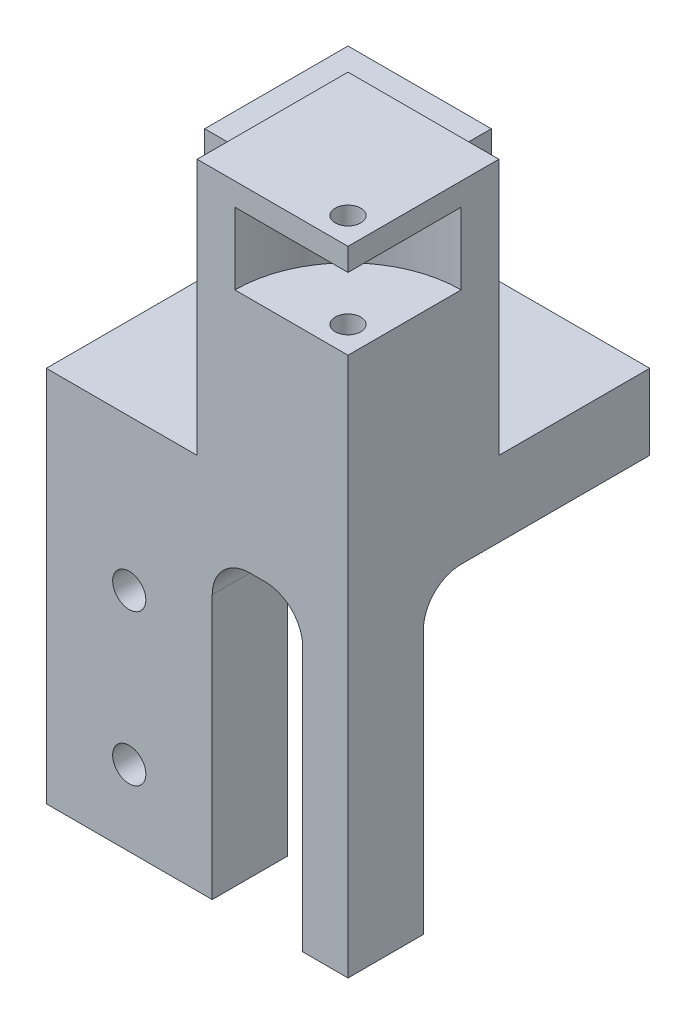
ISO-10303-21;
HEADER;
FILE_DESCRIPTION(('STEP AP214'),'2;1');
FILE_NAME('part.step','',(''),(''),'','','');
FILE_SCHEMA(('AUTOMOTIVE_DESIGN { 1 0 10303 214 1 1 1 1 }'));
ENDSEC;
DATA;
#1=APPLICATION_CONTEXT('core data for automotive mechanical design processes');
#2=APPLICATION_PROTOCOL_DEFINITION('international standard','automotive_design',2000,#1);
#3=PRODUCT_CONTEXT('',#1,'mechanical');
#4=PRODUCT('Part','Part','',(#3));
#5=PRODUCT_RELATED_PRODUCT_CATEGORY('part','',(#4));
#6=PRODUCT_DEFINITION_FORMATION('','',#4);
#7=PRODUCT_DEFINITION_CONTEXT('part definition',#1,'design');
#8=PRODUCT_DEFINITION('design','',#6,#7);
#9=PRODUCT_DEFINITION_SHAPE('','',#8);
#10=(LENGTH_UNIT() NAMED_UNIT(*) SI_UNIT(.MILLI.,.METRE.));
#11=(NAMED_UNIT(*) PLANE_ANGLE_UNIT() SI_UNIT($,.RADIAN.));
#12=(NAMED_UNIT(*) SI_UNIT($,.STERADIAN.) SOLID_ANGLE_UNIT());
#13=UNCERTAINTY_MEASURE_WITH_UNIT(LENGTH_MEASURE(1.E-05),#10,'distance_accuracy_value','');
#14=(GEOMETRIC_REPRESENTATION_CONTEXT(3) GLOBAL_UNCERTAINTY_ASSIGNED_CONTEXT((#13)) GLOBAL_UNIT_ASSIGNED_CONTEXT((#10,
#11,#12)) REPRESENTATION_CONTEXT('',''));
#15=CARTESIAN_POINT('',(0.,0.,0.));
#16=DIRECTION('',(0.,0.,1.));
#17=DIRECTION('',(1.,0.,0.));
#18=AXIS2_PLACEMENT_3D('',#15,#16,#17);
#19=CARTESIAN_POINT('',(-6.36538506760728,-50.,10.));
#20=DIRECTION('',(0.,1.,0.));
#21=DIRECTION('',(-1.,0.,0.));
#22=AXIS2_PLACEMENT_3D('',#19,#20,#21);
#23=PLANE('',#22);
#24=CARTESIAN_POINT('',(30.0990810264598,-50.,6.46446609406742));
#25=DIRECTION('',(0.,-1.,0.));
#26=DIRECTION('',(1.,0.,0.));
#27=AXIS2_PLACEMENT_3D('',#24,#25,#26);
#28=CIRCLE('',#27,1.69999999999999);
#29=CARTESIAN_POINT('',(31.7990810264598,-50.,6.46446609406742));
#30=VERTEX_POINT('',#29);
#31=EDGE_CURVE('E323',#30,#30,#28,.T.);
#32=ORIENTED_EDGE('',*,*,#31,.F.);
#33=EDGE_LOOP('',(#32));
#34=FACE_BOUND('',#33,.T.);
#35=DIRECTION('',(1.,0.,0.));
#36=VECTOR('',#35,1.);
#37=CARTESIAN_POINT('',(-6.36538506760728,-50.,10.));
#38=LINE('',#37,#36);
#39=CARTESIAN_POINT('',(27.6346149323927,-50.,10.));
#40=VERTEX_POINT('',#39);
#41=CARTESIAN_POINT('',(33.6346149323927,-50.,10.));
#42=VERTEX_POINT('',#41);
#43=EDGE_CURVE('E237',#40,#42,#38,.T.);
#44=ORIENTED_EDGE('',*,*,#43,.F.);
#45=DIRECTION('',(0.,0.,1.));
#46=VECTOR('',#45,1.);
#47=CARTESIAN_POINT('',(27.6346149323927,-50.,-30.001));
#48=LINE('',#47,#46);
#49=CARTESIAN_POINT('',(27.6346149323927,-50.,0.));
#50=VERTEX_POINT('',#49);
#51=EDGE_CURVE('E229',#50,#40,#48,.T.);
#52=ORIENTED_EDGE('',*,*,#51,.F.);
#53=DIRECTION('',(1.,0.,0.));
#54=VECTOR('',#53,1.);
#55=CARTESIAN_POINT('',(-6.36538506760728,-50.,0.));
#56=LINE('',#55,#54);
#57=CARTESIAN_POINT('',(33.6346149323927,-50.,0.));
#58=VERTEX_POINT('',#57);
#59=EDGE_CURVE('E250',#50,#58,#56,.T.);
#60=ORIENTED_EDGE('',*,*,#59,.T.);
#61=DIRECTION('',(0.,0.,-1.));
#62=VECTOR('',#61,1.);
#63=CARTESIAN_POINT('',(33.6346149323927,-50.,10.));
#64=LINE('',#63,#62);
#65=EDGE_CURVE('E259',#42,#58,#64,.T.);
#66=ORIENTED_EDGE('',*,*,#65,.F.);
#67=EDGE_LOOP('',(#44,#52,#60,#66));
#68=FACE_BOUND('',#67,.T.);
#69=ADVANCED_FACE('F39',(#34,#68),#23,.F.);
#70=CARTESIAN_POINT('',(0.,0.,0.));
#71=DIRECTION('',(0.,0.,1.));
#72=DIRECTION('',(1.,0.,0.));
#73=AXIS2_PLACEMENT_3D('',#70,#71,#72);
#74=PLANE('',#73);
#75=DIRECTION('',(0.,-1.,0.));
#76=VECTOR('',#75,1.);
#77=CARTESIAN_POINT('',(27.6346149323927,-50.,0.));
#78=LINE('',#77,#76);
#79=CARTESIAN_POINT('',(27.6346149323927,-15.,0.));
#80=VERTEX_POINT('',#79);
#81=EDGE_CURVE('E316',#80,#50,#78,.T.);
#82=ORIENTED_EDGE('',*,*,#81,.F.);
#83=DIRECTION('',(1.,0.,0.));
#84=VECTOR('',#83,1.);
#85=CARTESIAN_POINT('',(0.,-15.,0.));
#86=LINE('',#85,#84);
#87=CARTESIAN_POINT('',(33.6346149323927,-15.,0.));
#88=VERTEX_POINT('',#87);
#89=EDGE_CURVE('E56',#80,#88,#86,.T.);
#90=ORIENTED_EDGE('',*,*,#89,.T.);
#91=DIRECTION('',(0.,1.,0.));
#92=VECTOR('',#91,1.);
#93=CARTESIAN_POINT('',(33.6346149323927,0.,0.));
#94=LINE('',#93,#92);
#95=EDGE_CURVE('E253',#58,#88,#94,.T.);
#96=ORIENTED_EDGE('',*,*,#95,.F.);
#97=ORIENTED_EDGE('',*,*,#59,.F.);
#98=EDGE_LOOP('',(#82,#90,#96,#97));
#99=FACE_BOUND('',#98,.T.);
#100=ADVANCED_FACE('F485',(#99),#74,.F.);
#101=CARTESIAN_POINT('',(-6.36538506760727,0.,10.));
#102=DIRECTION('',(0.,-1.,0.));
#103=DIRECTION('',(1.,0.,0.));
#104=AXIS2_PLACEMENT_3D('',#101,#102,#103);
#105=PLANE('',#104);
#106=DIRECTION('',(1.,0.,0.));
#107=VECTOR('',#106,1.);
#108=CARTESIAN_POINT('',(-6.36538506760727,0.,-11.));
#109=LINE('',#108,#107);
#110=CARTESIAN_POINT('',(-6.36538506760727,0.,-11.));
#111=VERTEX_POINT('',#110);
#112=CARTESIAN_POINT('',(12.6346149323927,0.,-11.));
#113=VERTEX_POINT('',#112);
#114=EDGE_CURVE('E373',#111,#113,#109,.T.);
#115=ORIENTED_EDGE('',*,*,#114,.F.);
#116=DIRECTION('',(0.,0.,-1.));
#117=VECTOR('',#116,1.);
#118=CARTESIAN_POINT('',(-6.36538506760727,0.,10.));
#119=LINE('',#118,#117);
#120=CARTESIAN_POINT('',(-6.36538506760727,0.,10.));
#121=VERTEX_POINT('',#120);
#122=EDGE_CURVE('E247',#121,#111,#119,.T.);
#123=ORIENTED_EDGE('',*,*,#122,.F.);
#124=DIRECTION('',(-1.,0.,0.));
#125=VECTOR('',#124,1.);
#126=CARTESIAN_POINT('',(-6.36538506760727,0.,10.));
#127=LINE('',#126,#125);
#128=CARTESIAN_POINT('',(13.6346149323927,0.,10.));
#129=VERTEX_POINT('',#128);
#130=EDGE_CURVE('E245',#129,#121,#127,.T.);
#131=ORIENTED_EDGE('',*,*,#130,.F.);
#132=DIRECTION('',(0.,0.,1.));
#133=VECTOR('',#132,1.);
#134=CARTESIAN_POINT('',(13.6346149323927,0.,10.));
#135=LINE('',#134,#133);
#136=CARTESIAN_POINT('',(13.6346149323927,0.,-10.));
#137=VERTEX_POINT('',#136);
#138=EDGE_CURVE('E406',#137,#129,#135,.T.);
#139=ORIENTED_EDGE('',*,*,#138,.F.);
#140=DIRECTION('',(-1.,0.,0.));
#141=VECTOR('',#140,1.);
#142=CARTESIAN_POINT('',(33.6346149323927,0.,-10.));
#143=LINE('',#142,#141);
#144=CARTESIAN_POINT('',(33.6346149323927,0.,-10.));
#145=VERTEX_POINT('',#144);
#146=EDGE_CURVE('E401',#145,#137,#143,.T.);
#147=ORIENTED_EDGE('',*,*,#146,.F.);
#148=DIRECTION('',(0.,0.,-1.));
#149=VECTOR('',#148,1.);
#150=CARTESIAN_POINT('',(33.6346149323927,0.,10.));
#151=LINE('',#150,#149);
#152=CARTESIAN_POINT('',(33.6346149323927,0.,-30.));
#153=VERTEX_POINT('',#152);
#154=EDGE_CURVE('E257',#145,#153,#151,.T.);
#155=ORIENTED_EDGE('',*,*,#154,.T.);
#156=DIRECTION('',(-1.,0.,0.));
#157=VECTOR('',#156,1.);
#158=CARTESIAN_POINT('',(33.6346149323927,0.,-30.));
#159=LINE('',#158,#157);
#160=CARTESIAN_POINT('',(12.6346149323927,0.,-30.));
#161=VERTEX_POINT('',#160);
#162=EDGE_CURVE('E429',#153,#161,#159,.T.);
#163=ORIENTED_EDGE('',*,*,#162,.T.);
#164=DIRECTION('',(0.,0.,-1.));
#165=VECTOR('',#164,1.);
#166=CARTESIAN_POINT('',(12.6346149323927,0.,-30.));
#167=LINE('',#166,#165);
#168=EDGE_CURVE('E380',#113,#161,#167,.T.);
#169=ORIENTED_EDGE('',*,*,#168,.F.);
#170=EDGE_LOOP('',(#115,#123,#131,#139,#147,#155,#163,#169));
#171=FACE_BOUND('',#170,.T.);
#172=ADVANCED_FACE('F491',(#171),#105,.F.);
#173=CARTESIAN_POINT('',(-6.36538506760727,0.,10.));
#174=DIRECTION('',(1.,0.,0.));
#175=DIRECTION('',(0.,1.,0.));
#176=AXIS2_PLACEMENT_3D('',#173,#174,#175);
#177=PLANE('',#176);
#178=ORIENTED_EDGE('',*,*,#122,.T.);
#179=DIRECTION('',(0.,-1.,0.));
#180=VECTOR('',#179,1.);
#181=CARTESIAN_POINT('',(-6.36538506760727,17.,-11.));
#182=LINE('',#181,#180);
#183=CARTESIAN_POINT('',(-6.36538506760727,17.,-11.));
#184=VERTEX_POINT('',#183);
#185=EDGE_CURVE('E398',#184,#111,#182,.T.);
#186=ORIENTED_EDGE('',*,*,#185,.F.);
#187=DIRECTION('',(0.,0.,1.));
#188=VECTOR('',#187,1.);
#189=CARTESIAN_POINT('',(-6.36538506760727,17.,-30.));
#190=LINE('',#189,#188);
#191=CARTESIAN_POINT('',(-6.36538506760727,17.,-30.));
#192=VERTEX_POINT('',#191);
#193=EDGE_CURVE('E376',#192,#184,#190,.T.);
#194=ORIENTED_EDGE('',*,*,#193,.F.);
#195=DIRECTION('',(0.,-1.,0.));
#196=VECTOR('',#195,1.);
#197=CARTESIAN_POINT('',(-6.36538506760727,0.,-30.));
#198=LINE('',#197,#196);
#199=CARTESIAN_POINT('',(-6.36538506760727,-10.,-30.));
#200=VERTEX_POINT('',#199);
#201=EDGE_CURVE('E431',#192,#200,#198,.T.);
#202=ORIENTED_EDGE('',*,*,#201,.T.);
#203=DIRECTION('',(0.,0.,1.));
#204=VECTOR('',#203,1.);
#205=CARTESIAN_POINT('',(-6.36538506760727,-10.,-30.));
#206=LINE('',#205,#204);
#207=CARTESIAN_POINT('',(-6.36538506760727,-10.,-5.));
#208=VERTEX_POINT('',#207);
#209=EDGE_CURVE('E437',#200,#208,#206,.T.);
#210=ORIENTED_EDGE('',*,*,#209,.T.);
#211=CARTESIAN_POINT('',(-6.36538506760727,-15.,-5.));
#212=DIRECTION('',(1.,0.,0.));
#213=DIRECTION('',(0.,1.,0.));
#214=AXIS2_PLACEMENT_3D('',#211,#212,#213);
#215=CIRCLE('',#214,5.);
#216=CARTESIAN_POINT('',(-6.36538506760727,-15.,0.));
#217=VERTEX_POINT('',#216);
#218=EDGE_CURVE('E48',#208,#217,#215,.T.);
#219=ORIENTED_EDGE('',*,*,#218,.T.);
#220=DIRECTION('',(0.,-1.,0.));
#221=VECTOR('',#220,1.);
#222=CARTESIAN_POINT('',(-6.36538506760727,0.,0.));
#223=LINE('',#222,#221);
#224=CARTESIAN_POINT('',(-6.36538506760728,-50.,0.));
#225=VERTEX_POINT('',#224);
#226=EDGE_CURVE('E248',#217,#225,#223,.T.);
#227=ORIENTED_EDGE('',*,*,#226,.T.);
#228=DIRECTION('',(0.,0.,-1.));
#229=VECTOR('',#228,1.);
#230=CARTESIAN_POINT('',(-6.36538506760728,-50.,10.));
#231=LINE('',#230,#229);
#232=CARTESIAN_POINT('',(-6.36538506760728,-50.,10.));
#233=VERTEX_POINT('',#232);
#234=EDGE_CURVE('E262',#233,#225,#231,.T.);
#235=ORIENTED_EDGE('',*,*,#234,.F.);
#236=DIRECTION('',(0.,-1.,0.));
#237=VECTOR('',#236,1.);
#238=CARTESIAN_POINT('',(-6.36538506760727,0.,10.));
#239=LINE('',#238,#237);
#240=EDGE_CURVE('E234',#121,#233,#239,.T.);
#241=ORIENTED_EDGE('',*,*,#240,.F.);
#242=EDGE_LOOP('',(#178,#186,#194,#202,#210,#219,#227,#235,#241));
#243=FACE_BOUND('',#242,.T.);
#244=ADVANCED_FACE('F439',(#243),#177,.F.);
#245=CARTESIAN_POINT('',(15.6346149323927,-50.,0.));
#246=VERTEX_POINT('',#245);
#247=EDGE_CURVE('E228',#225,#246,#56,.T.);
#248=ORIENTED_EDGE('',*,*,#247,.T.);
#249=DIRECTION('',(0.,0.,1.));
#250=VECTOR('',#249,1.);
#251=CARTESIAN_POINT('',(15.6346149323927,-50.,-30.001));
#252=LINE('',#251,#250);
#253=CARTESIAN_POINT('',(15.6346149323927,-50.,10.));
#254=VERTEX_POINT('',#253);
#255=EDGE_CURVE('E213',#246,#254,#252,.T.);
#256=ORIENTED_EDGE('',*,*,#255,.T.);
#257=EDGE_CURVE('E225',#233,#254,#38,.T.);
#258=ORIENTED_EDGE('',*,*,#257,.F.);
#259=ORIENTED_EDGE('',*,*,#234,.T.);
#260=EDGE_LOOP('',(#248,#256,#258,#259));
#261=FACE_BOUND('',#260,.T.);
#262=ADVANCED_FACE('F223',(#261),#23,.F.);
#263=CARTESIAN_POINT('',(33.6346149323927,0.,10.));
#264=DIRECTION('',(-1.,0.,0.));
#265=DIRECTION('',(0.,0.,1.));
#266=AXIS2_PLACEMENT_3D('',#263,#264,#265);
#267=PLANE('',#266);
#268=DIRECTION('',(0.,1.,0.));
#269=VECTOR('',#268,1.);
#270=CARTESIAN_POINT('',(33.6346149323927,21.5,-5.));
#271=LINE('',#270,#269);
#272=CARTESIAN_POINT('',(33.6346149323927,21.5,-5.));
#273=VERTEX_POINT('',#272);
#274=CARTESIAN_POINT('',(33.6346149323927,31.,-5.));
#275=VERTEX_POINT('',#274);
#276=EDGE_CURVE('E371',#273,#275,#271,.T.);
#277=ORIENTED_EDGE('',*,*,#276,.F.);
#278=DIRECTION('',(0.,0.,-1.));
#279=VECTOR('',#278,1.);
#280=CARTESIAN_POINT('',(33.6346149323927,21.5,-5.));
#281=LINE('',#280,#279);
#282=CARTESIAN_POINT('',(33.6346149323927,21.5,10.));
#283=VERTEX_POINT('',#282);
#284=EDGE_CURVE('E360',#283,#273,#281,.T.);
#285=ORIENTED_EDGE('',*,*,#284,.F.);
#286=DIRECTION('',(0.,1.,0.));
#287=VECTOR('',#286,1.);
#288=CARTESIAN_POINT('',(33.6346149323927,0.,10.));
#289=LINE('',#288,#287);
#290=EDGE_CURVE('E239',#42,#283,#289,.T.);
#291=ORIENTED_EDGE('',*,*,#290,.F.);
#292=ORIENTED_EDGE('',*,*,#65,.T.);
#293=ORIENTED_EDGE('',*,*,#95,.T.);
#294=CARTESIAN_POINT('',(33.6346149323927,-15.,-5.));
#295=DIRECTION('',(-1.,0.,0.));
#296=DIRECTION('',(0.,0.,1.));
#297=AXIS2_PLACEMENT_3D('',#294,#295,#296);
#298=CIRCLE('',#297,5.);
#299=CARTESIAN_POINT('',(33.6346149323927,-10.,-5.));
#300=VERTEX_POINT('',#299);
#301=EDGE_CURVE('E11',#88,#300,#298,.T.);
#302=ORIENTED_EDGE('',*,*,#301,.T.);
#303=DIRECTION('',(0.,0.,1.));
#304=VECTOR('',#303,1.);
#305=CARTESIAN_POINT('',(33.6346149323927,-10.,-30.));
#306=LINE('',#305,#304);
#307=CARTESIAN_POINT('',(33.6346149323927,-10.,-30.));
#308=VERTEX_POINT('',#307);
#309=EDGE_CURVE('E251',#308,#300,#306,.T.);
#310=ORIENTED_EDGE('',*,*,#309,.F.);
#311=DIRECTION('',(0.,1.,0.));
#312=VECTOR('',#311,1.);
#313=CARTESIAN_POINT('',(33.6346149323927,0.,-30.));
#314=LINE('',#313,#312);
#315=EDGE_CURVE('E426',#308,#153,#314,.T.);
#316=ORIENTED_EDGE('',*,*,#315,.T.);
#317=ORIENTED_EDGE('',*,*,#154,.F.);
#318=DIRECTION('',(0.,-1.,0.));
#319=VECTOR('',#318,1.);
#320=CARTESIAN_POINT('',(33.6346149323927,34.,-10.));
#321=LINE('',#320,#319);
#322=CARTESIAN_POINT('',(33.6346149323927,34.,-10.));
#323=VERTEX_POINT('',#322);
#324=EDGE_CURVE('E423',#323,#145,#321,.T.);
#325=ORIENTED_EDGE('',*,*,#324,.F.);
#326=DIRECTION('',(0.,0.,-1.));
#327=VECTOR('',#326,1.);
#328=CARTESIAN_POINT('',(33.6346149323927,34.,10.));
#329=LINE('',#328,#327);
#330=CARTESIAN_POINT('',(33.6346149323927,34.,10.));
#331=VERTEX_POINT('',#330);
#332=EDGE_CURVE('E402',#331,#323,#329,.T.);
#333=ORIENTED_EDGE('',*,*,#332,.F.);
#334=CARTESIAN_POINT('',(33.6346149323927,31.,10.));
#335=VERTEX_POINT('',#334);
#336=EDGE_CURVE('E236',#335,#331,#289,.T.);
#337=ORIENTED_EDGE('',*,*,#336,.F.);
#338=DIRECTION('',(0.,0.,-1.));
#339=VECTOR('',#338,1.);
#340=CARTESIAN_POINT('',(33.6346149323927,31.,-5.));
#341=LINE('',#340,#339);
#342=EDGE_CURVE('E358',#335,#275,#341,.T.);
#343=ORIENTED_EDGE('',*,*,#342,.T.);
#344=EDGE_LOOP('',(#277,#285,#291,#292,#293,#302,#310,#316,#317,#325,#333,#337,#343));
#345=FACE_BOUND('',#344,.T.);
#346=ADVANCED_FACE('F497',(#345),#267,.F.);
#347=CARTESIAN_POINT('',(0.,0.,10.));
#348=DIRECTION('',(0.,0.,1.));
#349=DIRECTION('',(1.,0.,0.));
#350=AXIS2_PLACEMENT_3D('',#347,#348,#349);
#351=PLANE('',#350);
#352=CARTESIAN_POINT('',(4.63461493239273,-20.,10.));
#353=DIRECTION('',(0.,0.,1.));
#354=DIRECTION('',(1.,0.,0.));
#355=AXIS2_PLACEMENT_3D('',#352,#353,#354);
#356=CIRCLE('',#355,2.2);
#357=CARTESIAN_POINT('',(6.83461493239273,-20.,10.));
#358=VERTEX_POINT('',#357);
#359=EDGE_CURVE('E300',#358,#358,#356,.T.);
#360=ORIENTED_EDGE('',*,*,#359,.F.);
#361=EDGE_LOOP('',(#360));
#362=FACE_BOUND('',#361,.T.);
#363=CARTESIAN_POINT('',(4.63461493239273,-40.,10.));
#364=DIRECTION('',(0.,0.,1.));
#365=DIRECTION('',(1.,0.,0.));
#366=AXIS2_PLACEMENT_3D('',#363,#364,#365);
#367=CIRCLE('',#366,2.2);
#368=CARTESIAN_POINT('',(6.83461493239273,-40.,10.));
#369=VERTEX_POINT('',#368);
#370=EDGE_CURVE('E305',#369,#369,#367,.T.);
#371=ORIENTED_EDGE('',*,*,#370,.F.);
#372=EDGE_LOOP('',(#371));
#373=FACE_BOUND('',#372,.T.);
#374=DIRECTION('',(0.,1.,0.));
#375=VECTOR('',#374,1.);
#376=CARTESIAN_POINT('',(27.6346149323927,-50.,10.));
#377=LINE('',#376,#375);
#378=CARTESIAN_POINT('',(27.6346149323927,-15.,10.));
#379=VERTEX_POINT('',#378);
#380=EDGE_CURVE('E318',#40,#379,#377,.T.);
#381=ORIENTED_EDGE('',*,*,#380,.F.);
#382=ORIENTED_EDGE('',*,*,#43,.T.);
#383=ORIENTED_EDGE('',*,*,#290,.T.);
#384=DIRECTION('',(1.,0.,0.));
#385=VECTOR('',#384,1.);
#386=CARTESIAN_POINT('',(33.6346149323927,21.5,10.));
#387=LINE('',#386,#385);
#388=CARTESIAN_POINT('',(18.6346149323927,21.5,10.));
#389=VERTEX_POINT('',#388);
#390=EDGE_CURVE('E357',#389,#283,#387,.T.);
#391=ORIENTED_EDGE('',*,*,#390,.F.);
#392=DIRECTION('',(0.,1.,0.));
#393=VECTOR('',#392,1.);
#394=CARTESIAN_POINT('',(18.6346149323927,21.5,10.));
#395=LINE('',#394,#393);
#396=CARTESIAN_POINT('',(18.6346149323927,31.,10.));
#397=VERTEX_POINT('',#396);
#398=EDGE_CURVE('E363',#389,#397,#395,.T.);
#399=ORIENTED_EDGE('',*,*,#398,.T.);
#400=DIRECTION('',(1.,0.,0.));
#401=VECTOR('',#400,1.);
#402=CARTESIAN_POINT('',(33.6346149323927,31.,10.));
#403=LINE('',#402,#401);
#404=EDGE_CURVE('E366',#397,#335,#403,.T.);
#405=ORIENTED_EDGE('',*,*,#404,.T.);
#406=ORIENTED_EDGE('',*,*,#336,.T.);
#407=DIRECTION('',(1.,0.,0.));
#408=VECTOR('',#407,1.);
#409=CARTESIAN_POINT('',(33.6346149323927,34.,10.));
#410=LINE('',#409,#408);
#411=CARTESIAN_POINT('',(13.6346149323927,34.,10.));
#412=VERTEX_POINT('',#411);
#413=EDGE_CURVE('E410',#412,#331,#410,.T.);
#414=ORIENTED_EDGE('',*,*,#413,.F.);
#415=DIRECTION('',(0.,-1.,0.));
#416=VECTOR('',#415,1.);
#417=CARTESIAN_POINT('',(13.6346149323927,34.,10.));
#418=LINE('',#417,#416);
#419=EDGE_CURVE('E413',#412,#129,#418,.T.);
#420=ORIENTED_EDGE('',*,*,#419,.T.);
#421=ORIENTED_EDGE('',*,*,#130,.T.);
#422=ORIENTED_EDGE('',*,*,#240,.T.);
#423=ORIENTED_EDGE('',*,*,#257,.T.);
#424=DIRECTION('',(0.,-1.,0.));
#425=VECTOR('',#424,1.);
#426=CARTESIAN_POINT('',(15.6346149323927,-50.,10.));
#427=LINE('',#426,#425);
#428=CARTESIAN_POINT('',(15.6346149323927,-15.,10.));
#429=VERTEX_POINT('',#428);
#430=EDGE_CURVE('E209',#429,#254,#427,.T.);
#431=ORIENTED_EDGE('',*,*,#430,.F.);
#432=CARTESIAN_POINT('',(20.6346149323927,-15.,10.));
#433=DIRECTION('',(0.,0.,1.));
#434=DIRECTION('',(1.,0.,0.));
#435=AXIS2_PLACEMENT_3D('',#432,#433,#434);
#436=CIRCLE('',#435,5.);
#437=CARTESIAN_POINT('',(20.6346149323927,-10.,10.));
#438=VERTEX_POINT('',#437);
#439=EDGE_CURVE('E284',#429,#438,#436,.F.);
#440=ORIENTED_EDGE('',*,*,#439,.T.);
#441=DIRECTION('',(-1.,0.,0.));
#442=VECTOR('',#441,1.);
#443=CARTESIAN_POINT('',(27.6346149323927,-10.,10.));
#444=LINE('',#443,#442);
#445=CARTESIAN_POINT('',(22.6346149323927,-10.,10.));
#446=VERTEX_POINT('',#445);
#447=EDGE_CURVE('E219',#446,#438,#444,.T.);
#448=ORIENTED_EDGE('',*,*,#447,.F.);
#449=CARTESIAN_POINT('',(22.6346149323927,-15.,10.));
#450=DIRECTION('',(0.,0.,1.));
#451=DIRECTION('',(1.,0.,0.));
#452=AXIS2_PLACEMENT_3D('',#449,#450,#451);
#453=CIRCLE('',#452,5.);
#454=EDGE_CURVE('E286',#446,#379,#453,.F.);
#455=ORIENTED_EDGE('',*,*,#454,.T.);
#456=EDGE_LOOP('',(#381,#382,#383,#391,#399,#405,#406,#414,#420,#421,#422,#423,#431,#440,#448,#455));
#457=FACE_BOUND('',#456,.T.);
#458=ADVANCED_FACE('F232',(#362,#373,#457),#351,.T.);
#459=CARTESIAN_POINT('',(4.63461493239273,-20.,0.));
#460=DIRECTION('',(0.,0.,1.));
#461=DIRECTION('',(1.,0.,0.));
#462=AXIS2_PLACEMENT_3D('',#459,#460,#461);
#463=CIRCLE('',#462,2.2);
#464=CARTESIAN_POINT('',(6.83461493239273,-20.,0.));
#465=VERTEX_POINT('',#464);
#466=EDGE_CURVE('E294',#465,#465,#463,.F.);
#467=ORIENTED_EDGE('',*,*,#466,.F.);
#468=EDGE_LOOP('',(#467));
#469=FACE_BOUND('',#468,.T.);
#470=CARTESIAN_POINT('',(4.63461493239273,-40.,0.));
#471=DIRECTION('',(0.,0.,1.));
#472=DIRECTION('',(1.,0.,0.));
#473=AXIS2_PLACEMENT_3D('',#470,#471,#472);
#474=CIRCLE('',#473,2.2);
#475=CARTESIAN_POINT('',(6.83461493239273,-40.,0.));
#476=VERTEX_POINT('',#475);
#477=EDGE_CURVE('E309',#476,#476,#474,.F.);
#478=ORIENTED_EDGE('',*,*,#477,.F.);
#479=EDGE_LOOP('',(#478));
#480=FACE_BOUND('',#479,.T.);
#481=ORIENTED_EDGE('',*,*,#226,.F.);
#482=DIRECTION('',(1.,0.,0.));
#483=VECTOR('',#482,1.);
#484=CARTESIAN_POINT('',(0.,-15.,0.));
#485=LINE('',#484,#483);
#486=CARTESIAN_POINT('',(15.6346149323927,-15.,0.));
#487=VERTEX_POINT('',#486);
#488=EDGE_CURVE('E281',#217,#487,#485,.T.);
#489=ORIENTED_EDGE('',*,*,#488,.T.);
#490=DIRECTION('',(0.,1.,0.));
#491=VECTOR('',#490,1.);
#492=CARTESIAN_POINT('',(15.6346149323927,-50.,0.));
#493=LINE('',#492,#491);
#494=EDGE_CURVE('E291',#246,#487,#493,.T.);
#495=ORIENTED_EDGE('',*,*,#494,.F.);
#496=ORIENTED_EDGE('',*,*,#247,.F.);
#497=EDGE_LOOP('',(#481,#489,#495,#496));
#498=FACE_BOUND('',#497,.T.);
#499=ADVANCED_FACE('F449',(#469,#480,#498),#74,.F.);
#500=CARTESIAN_POINT('',(33.6346149323927,-10.,-30.));
#501=DIRECTION('',(0.,-1.,0.));
#502=DIRECTION('',(0.,0.,-1.));
#503=AXIS2_PLACEMENT_3D('',#500,#501,#502);
#504=PLANE('',#503);
#505=ORIENTED_EDGE('',*,*,#447,.T.);
#506=DIRECTION('',(0.,0.,1.));
#507=VECTOR('',#506,1.);
#508=CARTESIAN_POINT('',(20.6346149323927,-10.,-30.));
#509=LINE('',#508,#507);
#510=CARTESIAN_POINT('',(20.6346149323927,-10.,-5.));
#511=VERTEX_POINT('',#510);
#512=EDGE_CURVE('E277',#438,#511,#509,.F.);
#513=ORIENTED_EDGE('',*,*,#512,.T.);
#514=DIRECTION('',(1.,0.,0.));
#515=VECTOR('',#514,1.);
#516=CARTESIAN_POINT('',(33.6346149323927,-10.,-5.));
#517=LINE('',#516,#515);
#518=EDGE_CURVE('E275',#511,#208,#517,.F.);
#519=ORIENTED_EDGE('',*,*,#518,.T.);
#520=ORIENTED_EDGE('',*,*,#209,.F.);
#521=DIRECTION('',(1.,0.,0.));
#522=VECTOR('',#521,1.);
#523=CARTESIAN_POINT('',(33.6346149323927,-10.,-30.));
#524=LINE('',#523,#522);
#525=EDGE_CURVE('E434',#200,#308,#524,.T.);
#526=ORIENTED_EDGE('',*,*,#525,.T.);
#527=ORIENTED_EDGE('',*,*,#309,.T.);
#528=DIRECTION('',(1.,0.,0.));
#529=VECTOR('',#528,1.);
#530=CARTESIAN_POINT('',(33.6346149323927,-10.,-5.));
#531=LINE('',#530,#529);
#532=CARTESIAN_POINT('',(22.6346149323927,-10.,-5.));
#533=VERTEX_POINT('',#532);
#534=EDGE_CURVE('E270',#300,#533,#531,.F.);
#535=ORIENTED_EDGE('',*,*,#534,.T.);
#536=DIRECTION('',(0.,0.,1.));
#537=VECTOR('',#536,1.);
#538=CARTESIAN_POINT('',(22.6346149323927,-10.,-30.));
#539=LINE('',#538,#537);
#540=EDGE_CURVE('E272',#533,#446,#539,.T.);
#541=ORIENTED_EDGE('',*,*,#540,.T.);
#542=EDGE_LOOP('',(#505,#513,#519,#520,#526,#527,#535,#541));
#543=FACE_BOUND('',#542,.T.);
#544=ADVANCED_FACE('F466',(#543),#504,.T.);
#545=CARTESIAN_POINT('',(0.,0.,-30.));
#546=DIRECTION('',(0.,0.,-1.));
#547=DIRECTION('',(-1.,0.,0.));
#548=AXIS2_PLACEMENT_3D('',#545,#546,#547);
#549=PLANE('',#548);
#550=ORIENTED_EDGE('',*,*,#315,.F.);
#551=ORIENTED_EDGE('',*,*,#525,.F.);
#552=ORIENTED_EDGE('',*,*,#201,.F.);
#553=DIRECTION('',(-1.,0.,0.));
#554=VECTOR('',#553,1.);
#555=CARTESIAN_POINT('',(-6.36538506760727,17.,-30.));
#556=LINE('',#555,#554);
#557=CARTESIAN_POINT('',(12.6346149323927,17.,-30.));
#558=VERTEX_POINT('',#557);
#559=EDGE_CURVE('E384',#558,#192,#556,.T.);
#560=ORIENTED_EDGE('',*,*,#559,.F.);
#561=DIRECTION('',(0.,-1.,0.));
#562=VECTOR('',#561,1.);
#563=CARTESIAN_POINT('',(12.6346149323927,17.,-30.));
#564=LINE('',#563,#562);
#565=EDGE_CURVE('E387',#558,#161,#564,.T.);
#566=ORIENTED_EDGE('',*,*,#565,.T.);
#567=ORIENTED_EDGE('',*,*,#162,.F.);
#568=EDGE_LOOP('',(#550,#551,#552,#560,#566,#567));
#569=FACE_BOUND('',#568,.T.);
#570=ADVANCED_FACE('F464',(#569),#549,.T.);
#571=CARTESIAN_POINT('',(33.6346149323927,34.,-10.));
#572=DIRECTION('',(0.,0.,1.));
#573=DIRECTION('',(1.,0.,0.));
#574=AXIS2_PLACEMENT_3D('',#571,#572,#573);
#575=PLANE('',#574);
#576=ORIENTED_EDGE('',*,*,#146,.T.);
#577=DIRECTION('',(0.,-1.,0.));
#578=VECTOR('',#577,1.);
#579=CARTESIAN_POINT('',(13.6346149323927,34.,-10.));
#580=LINE('',#579,#578);
#581=CARTESIAN_POINT('',(13.6346149323927,34.,-10.));
#582=VERTEX_POINT('',#581);
#583=EDGE_CURVE('E420',#582,#137,#580,.T.);
#584=ORIENTED_EDGE('',*,*,#583,.F.);
#585=DIRECTION('',(-1.,0.,0.));
#586=VECTOR('',#585,1.);
#587=CARTESIAN_POINT('',(33.6346149323927,34.,-10.));
#588=LINE('',#587,#586);
#589=EDGE_CURVE('E405',#323,#582,#588,.T.);
#590=ORIENTED_EDGE('',*,*,#589,.F.);
#591=ORIENTED_EDGE('',*,*,#324,.T.);
#592=EDGE_LOOP('',(#576,#584,#590,#591));
#593=FACE_BOUND('',#592,.T.);
#594=ADVANCED_FACE('F518',(#593),#575,.F.);
#595=CARTESIAN_POINT('',(13.6346149323927,34.,10.));
#596=DIRECTION('',(1.,0.,0.));
#597=DIRECTION('',(0.,1.,0.));
#598=AXIS2_PLACEMENT_3D('',#595,#596,#597);
#599=PLANE('',#598);
#600=ORIENTED_EDGE('',*,*,#138,.T.);
#601=ORIENTED_EDGE('',*,*,#419,.F.);
#602=DIRECTION('',(0.,0.,1.));
#603=VECTOR('',#602,1.);
#604=CARTESIAN_POINT('',(13.6346149323927,34.,10.));
#605=LINE('',#604,#603);
#606=EDGE_CURVE('E408',#582,#412,#605,.T.);
#607=ORIENTED_EDGE('',*,*,#606,.F.);
#608=ORIENTED_EDGE('',*,*,#583,.T.);
#609=EDGE_LOOP('',(#600,#601,#607,#608));
#610=FACE_BOUND('',#609,.T.);
#611=ADVANCED_FACE('F521',(#610),#599,.F.);
#612=CARTESIAN_POINT('',(0.,34.,0.));
#613=DIRECTION('',(0.,1.,0.));
#614=DIRECTION('',(-1.,0.,0.));
#615=AXIS2_PLACEMENT_3D('',#612,#613,#614);
#616=PLANE('',#615);
#617=CARTESIAN_POINT('',(30.0990810264598,34.,6.46446609406742));
#618=DIRECTION('',(0.,-1.,0.));
#619=DIRECTION('',(1.,0.,0.));
#620=AXIS2_PLACEMENT_3D('',#617,#618,#619);
#621=CIRCLE('',#620,1.69999999999999);
#622=CARTESIAN_POINT('',(31.7990810264598,34.,6.46446609406742));
#623=VERTEX_POINT('',#622);
#624=EDGE_CURVE('E268',#623,#623,#621,.T.);
#625=ORIENTED_EDGE('',*,*,#624,.T.);
#626=EDGE_LOOP('',(#625));
#627=FACE_BOUND('',#626,.T.);
#628=ORIENTED_EDGE('',*,*,#332,.T.);
#629=ORIENTED_EDGE('',*,*,#589,.T.);
#630=ORIENTED_EDGE('',*,*,#606,.T.);
#631=ORIENTED_EDGE('',*,*,#413,.T.);
#632=EDGE_LOOP('',(#628,#629,#630,#631));
#633=FACE_BOUND('',#632,.T.);
#634=ADVANCED_FACE('F525',(#627,#633),#616,.T.);
#635=CARTESIAN_POINT('',(-6.36538506760727,17.,-11.));
#636=DIRECTION('',(0.,0.,-1.));
#637=DIRECTION('',(-1.,0.,0.));
#638=AXIS2_PLACEMENT_3D('',#635,#636,#637);
#639=PLANE('',#638);
#640=DIRECTION('',(0.,-1.,0.));
#641=VECTOR('',#640,1.);
#642=CARTESIAN_POINT('',(12.6346149323927,17.,-11.));
#643=LINE('',#642,#641);
#644=CARTESIAN_POINT('',(12.6346149323927,5.5,-11.));
#645=VERTEX_POINT('',#644);
#646=EDGE_CURVE('E394',#645,#113,#643,.T.);
#647=ORIENTED_EDGE('',*,*,#646,.F.);
#648=DIRECTION('',(1.,0.,0.));
#649=VECTOR('',#648,1.);
#650=CARTESIAN_POINT('',(-2.36538506760727,5.5,-11.));
#651=LINE('',#650,#649);
#652=CARTESIAN_POINT('',(-2.36538506760727,5.5,-11.));
#653=VERTEX_POINT('',#652);
#654=EDGE_CURVE('E339',#653,#645,#651,.T.);
#655=ORIENTED_EDGE('',*,*,#654,.F.);
#656=DIRECTION('',(0.,1.,0.));
#657=VECTOR('',#656,1.);
#658=CARTESIAN_POINT('',(-2.36538506760727,5.5,-11.));
#659=LINE('',#658,#657);
#660=CARTESIAN_POINT('',(-2.36538506760727,15.,-11.));
#661=VERTEX_POINT('',#660);
#662=EDGE_CURVE('E348',#653,#661,#659,.T.);
#663=ORIENTED_EDGE('',*,*,#662,.T.);
#664=DIRECTION('',(1.,0.,0.));
#665=VECTOR('',#664,1.);
#666=CARTESIAN_POINT('',(-2.36538506760727,15.,-11.));
#667=LINE('',#666,#665);
#668=CARTESIAN_POINT('',(12.6346149323927,15.,-11.));
#669=VERTEX_POINT('',#668);
#670=EDGE_CURVE('E336',#661,#669,#667,.T.);
#671=ORIENTED_EDGE('',*,*,#670,.T.);
#672=CARTESIAN_POINT('',(12.6346149323927,17.,-11.));
#673=VERTEX_POINT('',#672);
#674=EDGE_CURVE('E395',#673,#669,#643,.T.);
#675=ORIENTED_EDGE('',*,*,#674,.F.);
#676=DIRECTION('',(1.,0.,0.));
#677=VECTOR('',#676,1.);
#678=CARTESIAN_POINT('',(-6.36538506760727,17.,-11.));
#679=LINE('',#678,#677);
#680=EDGE_CURVE('E379',#184,#673,#679,.T.);
#681=ORIENTED_EDGE('',*,*,#680,.F.);
#682=ORIENTED_EDGE('',*,*,#185,.T.);
#683=ORIENTED_EDGE('',*,*,#114,.T.);
#684=EDGE_LOOP('',(#647,#655,#663,#671,#675,#681,#682,#683));
#685=FACE_BOUND('',#684,.T.);
#686=ADVANCED_FACE('F455',(#685),#639,.F.);
#687=CARTESIAN_POINT('',(12.6346149323927,17.,-30.));
#688=DIRECTION('',(-1.,0.,0.));
#689=DIRECTION('',(0.,-1.,0.));
#690=AXIS2_PLACEMENT_3D('',#687,#688,#689);
#691=PLANE('',#690);
#692=DIRECTION('',(0.,1.,0.));
#693=VECTOR('',#692,1.);
#694=CARTESIAN_POINT('',(12.6346149323927,5.5,-26.));
#695=LINE('',#694,#693);
#696=CARTESIAN_POINT('',(12.6346149323927,5.5,-26.));
#697=VERTEX_POINT('',#696);
#698=CARTESIAN_POINT('',(12.6346149323927,15.,-26.));
#699=VERTEX_POINT('',#698);
#700=EDGE_CURVE('E341',#697,#699,#695,.T.);
#701=ORIENTED_EDGE('',*,*,#700,.F.);
#702=DIRECTION('',(0.,0.,-1.));
#703=VECTOR('',#702,1.);
#704=CARTESIAN_POINT('',(12.6346149323927,5.5,-11.));
#705=LINE('',#704,#703);
#706=EDGE_CURVE('E332',#645,#697,#705,.T.);
#707=ORIENTED_EDGE('',*,*,#706,.F.);
#708=ORIENTED_EDGE('',*,*,#646,.T.);
#709=ORIENTED_EDGE('',*,*,#168,.T.);
#710=ORIENTED_EDGE('',*,*,#565,.F.);
#711=DIRECTION('',(0.,0.,-1.));
#712=VECTOR('',#711,1.);
#713=CARTESIAN_POINT('',(12.6346149323927,17.,-30.));
#714=LINE('',#713,#712);
#715=EDGE_CURVE('E382',#673,#558,#714,.T.);
#716=ORIENTED_EDGE('',*,*,#715,.F.);
#717=ORIENTED_EDGE('',*,*,#674,.T.);
#718=DIRECTION('',(0.,0.,-1.));
#719=VECTOR('',#718,1.);
#720=CARTESIAN_POINT('',(12.6346149323927,15.,-11.));
#721=LINE('',#720,#719);
#722=EDGE_CURVE('E331',#669,#699,#721,.T.);
#723=ORIENTED_EDGE('',*,*,#722,.T.);
#724=EDGE_LOOP('',(#701,#707,#708,#709,#710,#716,#717,#723));
#725=FACE_BOUND('',#724,.T.);
#726=ADVANCED_FACE('F532',(#725),#691,.F.);
#727=CARTESIAN_POINT('',(0.,17.,0.));
#728=DIRECTION('',(0.,1.,0.));
#729=DIRECTION('',(-1.,0.,0.));
#730=AXIS2_PLACEMENT_3D('',#727,#728,#729);
#731=PLANE('',#730);
#732=CARTESIAN_POINT('',(9.09908102646015,17.,-14.5355339059329));
#733=DIRECTION('',(0.,1.,0.));
#734=DIRECTION('',(-1.,0.,0.));
#735=AXIS2_PLACEMENT_3D('',#732,#733,#734);
#736=CIRCLE('',#735,1.7);
#737=CARTESIAN_POINT('',(7.39908102646015,17.,-14.5355339059329));
#738=VERTEX_POINT('',#737);
#739=EDGE_CURVE('E597',#738,#738,#736,.T.);
#740=ORIENTED_EDGE('',*,*,#739,.F.);
#741=EDGE_LOOP('',(#740));
#742=FACE_BOUND('',#741,.T.);
#743=ORIENTED_EDGE('',*,*,#193,.T.);
#744=ORIENTED_EDGE('',*,*,#680,.T.);
#745=ORIENTED_EDGE('',*,*,#715,.T.);
#746=ORIENTED_EDGE('',*,*,#559,.T.);
#747=EDGE_LOOP('',(#743,#744,#745,#746));
#748=FACE_BOUND('',#747,.T.);
#749=ADVANCED_FACE('F459',(#742,#748),#731,.T.);
#750=CARTESIAN_POINT('',(33.6346149323927,21.5,10.));
#751=DIRECTION('',(0.,1.,0.));
#752=DIRECTION('',(-1.,0.,0.));
#753=AXIS2_PLACEMENT_3D('',#750,#751,#752);
#754=CYLINDRICAL_SURFACE('',#753,15.);
#755=CARTESIAN_POINT('',(33.6346149323927,31.,10.));
#756=DIRECTION('',(0.,1.,0.));
#757=DIRECTION('',(1.,0.,0.));
#758=AXIS2_PLACEMENT_3D('',#755,#756,#757);
#759=CIRCLE('',#758,15.);
#760=EDGE_CURVE('E351',#275,#397,#759,.T.);
#761=ORIENTED_EDGE('',*,*,#760,.T.);
#762=ORIENTED_EDGE('',*,*,#398,.F.);
#763=CARTESIAN_POINT('',(33.6346149323927,21.5,10.));
#764=DIRECTION('',(0.,1.,0.));
#765=DIRECTION('',(1.,0.,0.));
#766=AXIS2_PLACEMENT_3D('',#763,#764,#765);
#767=CIRCLE('',#766,15.);
#768=EDGE_CURVE('E354',#273,#389,#767,.T.);
#769=ORIENTED_EDGE('',*,*,#768,.F.);
#770=ORIENTED_EDGE('',*,*,#276,.T.);
#771=EDGE_LOOP('',(#761,#762,#769,#770));
#772=FACE_BOUND('',#771,.T.);
#773=ADVANCED_FACE('F538',(#772),#754,.F.);
#774=CARTESIAN_POINT('',(33.6346149323927,21.5,10.));
#775=DIRECTION('',(0.,-1.,0.));
#776=DIRECTION('',(1.,0.,0.));
#777=AXIS2_PLACEMENT_3D('',#774,#775,#776);
#778=PLANE('',#777);
#779=CARTESIAN_POINT('',(30.0990810264598,21.5,6.46446609406742));
#780=DIRECTION('',(0.,-1.,0.));
#781=DIRECTION('',(1.,0.,0.));
#782=AXIS2_PLACEMENT_3D('',#779,#780,#781);
#783=CIRCLE('',#782,1.69999999999999);
#784=CARTESIAN_POINT('',(31.7990810264598,21.5,6.46446609406742));
#785=VERTEX_POINT('',#784);
#786=EDGE_CURVE('E267',#785,#785,#783,.T.);
#787=ORIENTED_EDGE('',*,*,#786,.T.);
#788=EDGE_LOOP('',(#787));
#789=FACE_BOUND('',#788,.T.);
#790=ORIENTED_EDGE('',*,*,#768,.T.);
#791=ORIENTED_EDGE('',*,*,#390,.T.);
#792=ORIENTED_EDGE('',*,*,#284,.T.);
#793=EDGE_LOOP('',(#790,#791,#792));
#794=FACE_BOUND('',#793,.T.);
#795=ADVANCED_FACE('F542',(#789,#794),#778,.F.);
#796=CARTESIAN_POINT('',(33.6346149323927,31.,10.));
#797=DIRECTION('',(0.,-1.,0.));
#798=DIRECTION('',(1.,0.,0.));
#799=AXIS2_PLACEMENT_3D('',#796,#797,#798);
#800=PLANE('',#799);
#801=CARTESIAN_POINT('',(30.0990810264598,31.,6.46446609406742));
#802=DIRECTION('',(0.,-1.,0.));
#803=DIRECTION('',(1.,0.,0.));
#804=AXIS2_PLACEMENT_3D('',#801,#802,#803);
#805=CIRCLE('',#804,1.69999999999999);
#806=CARTESIAN_POINT('',(31.7990810264598,31.,6.46446609406742));
#807=VERTEX_POINT('',#806);
#808=EDGE_CURVE('E264',#807,#807,#805,.T.);
#809=ORIENTED_EDGE('',*,*,#808,.F.);
#810=EDGE_LOOP('',(#809));
#811=FACE_BOUND('',#810,.T.);
#812=ORIENTED_EDGE('',*,*,#760,.F.);
#813=ORIENTED_EDGE('',*,*,#342,.F.);
#814=ORIENTED_EDGE('',*,*,#404,.F.);
#815=EDGE_LOOP('',(#812,#813,#814));
#816=FACE_BOUND('',#815,.T.);
#817=ADVANCED_FACE('F544',(#811,#816),#800,.T.);
#818=CARTESIAN_POINT('',(12.6346149323927,5.5,-11.));
#819=DIRECTION('',(0.,1.,0.));
#820=DIRECTION('',(-1.,0.,0.));
#821=AXIS2_PLACEMENT_3D('',#818,#819,#820);
#822=CYLINDRICAL_SURFACE('',#821,15.);
#823=CARTESIAN_POINT('',(12.6346149323927,15.,-11.));
#824=DIRECTION('',(0.,1.,0.));
#825=DIRECTION('',(1.,0.,0.));
#826=AXIS2_PLACEMENT_3D('',#823,#824,#825);
#827=CIRCLE('',#826,15.);
#828=EDGE_CURVE('E344',#699,#661,#827,.T.);
#829=ORIENTED_EDGE('',*,*,#828,.T.);
#830=ORIENTED_EDGE('',*,*,#662,.F.);
#831=CARTESIAN_POINT('',(12.6346149323927,5.5,-11.));
#832=DIRECTION('',(0.,1.,0.));
#833=DIRECTION('',(1.,0.,0.));
#834=AXIS2_PLACEMENT_3D('',#831,#832,#833);
#835=CIRCLE('',#834,15.);
#836=EDGE_CURVE('E335',#697,#653,#835,.T.);
#837=ORIENTED_EDGE('',*,*,#836,.F.);
#838=ORIENTED_EDGE('',*,*,#700,.T.);
#839=EDGE_LOOP('',(#829,#830,#837,#838));
#840=FACE_BOUND('',#839,.T.);
#841=ADVANCED_FACE('F547',(#840),#822,.F.);
#842=CARTESIAN_POINT('',(12.6346149323927,5.5,-11.));
#843=DIRECTION('',(0.,-1.,0.));
#844=DIRECTION('',(1.,0.,0.));
#845=AXIS2_PLACEMENT_3D('',#842,#843,#844);
#846=PLANE('',#845);
#847=CARTESIAN_POINT('',(9.09908102646015,5.5,-14.5355339059329));
#848=DIRECTION('',(0.,-1.,0.));
#849=DIRECTION('',(1.,0.,0.));
#850=AXIS2_PLACEMENT_3D('',#847,#848,#849);
#851=CIRCLE('',#850,1.7);
#852=CARTESIAN_POINT('',(10.7990810264602,5.5,-14.5355339059329));
#853=VERTEX_POINT('',#852);
#854=EDGE_CURVE('E312',#853,#853,#851,.T.);
#855=ORIENTED_EDGE('',*,*,#854,.T.);
#856=EDGE_LOOP('',(#855));
#857=FACE_BOUND('',#856,.T.);
#858=ORIENTED_EDGE('',*,*,#706,.T.);
#859=ORIENTED_EDGE('',*,*,#836,.T.);
#860=ORIENTED_EDGE('',*,*,#654,.T.);
#861=EDGE_LOOP('',(#858,#859,#860));
#862=FACE_BOUND('',#861,.T.);
#863=ADVANCED_FACE('F554',(#857,#862),#846,.F.);
#864=CARTESIAN_POINT('',(12.6346149323927,15.,-11.));
#865=DIRECTION('',(0.,-1.,0.));
#866=DIRECTION('',(1.,0.,0.));
#867=AXIS2_PLACEMENT_3D('',#864,#865,#866);
#868=PLANE('',#867);
#869=CARTESIAN_POINT('',(9.09908102646015,15.,-14.5355339059329));
#870=DIRECTION('',(0.,-1.,0.));
#871=DIRECTION('',(1.,0.,0.));
#872=AXIS2_PLACEMENT_3D('',#869,#870,#871);
#873=CIRCLE('',#872,1.7);
#874=CARTESIAN_POINT('',(10.7990810264602,15.,-14.5355339059329));
#875=VERTEX_POINT('',#874);
#876=EDGE_CURVE('E43',#875,#875,#873,.T.);
#877=ORIENTED_EDGE('',*,*,#876,.F.);
#878=EDGE_LOOP('',(#877));
#879=FACE_BOUND('',#878,.T.);
#880=ORIENTED_EDGE('',*,*,#722,.F.);
#881=ORIENTED_EDGE('',*,*,#670,.F.);
#882=ORIENTED_EDGE('',*,*,#828,.F.);
#883=EDGE_LOOP('',(#880,#881,#882));
#884=FACE_BOUND('',#883,.T.);
#885=ADVANCED_FACE('F556',(#879,#884),#868,.T.);
#886=CARTESIAN_POINT('',(30.0990810264598,34.,6.46446609406742));
#887=DIRECTION('',(0.,-1.,0.));
#888=DIRECTION('',(1.,0.,0.));
#889=AXIS2_PLACEMENT_3D('',#886,#887,#888);
#890=CYLINDRICAL_SURFACE('',#889,1.69999999999999);
#891=ORIENTED_EDGE('',*,*,#808,.T.);
#892=EDGE_LOOP('',(#891));
#893=FACE_BOUND('',#892,.T.);
#894=ORIENTED_EDGE('',*,*,#624,.F.);
#895=EDGE_LOOP('',(#894));
#896=FACE_BOUND('',#895,.T.);
#897=ADVANCED_FACE('F559',(#893,#896),#890,.F.);
#898=ORIENTED_EDGE('',*,*,#31,.T.);
#899=EDGE_LOOP('',(#898));
#900=FACE_BOUND('',#899,.T.);
#901=ORIENTED_EDGE('',*,*,#786,.F.);
#902=EDGE_LOOP('',(#901));
#903=FACE_BOUND('',#902,.T.);
#904=ADVANCED_FACE('F566',(#900,#903),#890,.F.);
#905=CARTESIAN_POINT('',(27.6346149323927,-50.,-30.001));
#906=DIRECTION('',(1.,0.,0.));
#907=DIRECTION('',(0.,1.,0.));
#908=AXIS2_PLACEMENT_3D('',#905,#906,#907);
#909=PLANE('',#908);
#910=ORIENTED_EDGE('',*,*,#380,.T.);
#911=DIRECTION('',(0.,0.,1.));
#912=VECTOR('',#911,1.);
#913=CARTESIAN_POINT('',(27.6346149323927,-15.,-30.001));
#914=LINE('',#913,#912);
#915=EDGE_CURVE('E279',#379,#80,#914,.F.);
#916=ORIENTED_EDGE('',*,*,#915,.T.);
#917=ORIENTED_EDGE('',*,*,#81,.T.);
#918=ORIENTED_EDGE('',*,*,#51,.T.);
#919=EDGE_LOOP('',(#910,#916,#917,#918));
#920=FACE_BOUND('',#919,.T.);
#921=ADVANCED_FACE('F568',(#920),#909,.F.);
#922=CARTESIAN_POINT('',(15.6346149323927,-50.,-30.001));
#923=DIRECTION('',(-1.,0.,0.));
#924=DIRECTION('',(0.,0.,1.));
#925=AXIS2_PLACEMENT_3D('',#922,#923,#924);
#926=PLANE('',#925);
#927=ORIENTED_EDGE('',*,*,#494,.T.);
#928=DIRECTION('',(0.,0.,1.));
#929=VECTOR('',#928,1.);
#930=CARTESIAN_POINT('',(15.6346149323927,-15.,-30.001));
#931=LINE('',#930,#929);
#932=EDGE_CURVE('E216',#487,#429,#931,.T.);
#933=ORIENTED_EDGE('',*,*,#932,.T.);
#934=ORIENTED_EDGE('',*,*,#430,.T.);
#935=ORIENTED_EDGE('',*,*,#255,.F.);
#936=EDGE_LOOP('',(#927,#933,#934,#935));
#937=FACE_BOUND('',#936,.T.);
#938=ADVANCED_FACE('F212',(#937),#926,.F.);
#939=CARTESIAN_POINT('',(0.,-15.,-5.));
#940=DIRECTION('',(1.,0.,0.));
#941=DIRECTION('',(0.,0.,-1.));
#942=AXIS2_PLACEMENT_3D('',#939,#940,#941);
#943=CYLINDRICAL_SURFACE('',#942,5.);
#944=ORIENTED_EDGE('',*,*,#218,.F.);
#945=ORIENTED_EDGE('',*,*,#518,.F.);
#946=CARTESIAN_POINT('',(20.6346149323927,-15.,-5.));
#947=DIRECTION('',(0.707106781186547,0.,0.707106781186547));
#948=DIRECTION('',(0.707106781186547,0.,-0.707106781186547));
#949=AXIS2_PLACEMENT_3D('',#946,#947,#948);
#950=ELLIPSE('',#949,7.07106781186547,5.);
#951=EDGE_CURVE('E289',#487,#511,#950,.F.);
#952=ORIENTED_EDGE('',*,*,#951,.F.);
#953=ORIENTED_EDGE('',*,*,#488,.F.);
#954=EDGE_LOOP('',(#944,#945,#952,#953));
#955=FACE_BOUND('',#954,.T.);
#956=ADVANCED_FACE('F446',(#955),#943,.F.);
#957=CARTESIAN_POINT('',(20.6346149323927,-15.,-30.001));
#958=DIRECTION('',(0.,0.,1.));
#959=DIRECTION('',(1.,0.,0.));
#960=AXIS2_PLACEMENT_3D('',#957,#958,#959);
#961=CYLINDRICAL_SURFACE('',#960,5.);
#962=ORIENTED_EDGE('',*,*,#951,.T.);
#963=ORIENTED_EDGE('',*,*,#512,.F.);
#964=ORIENTED_EDGE('',*,*,#439,.F.);
#965=ORIENTED_EDGE('',*,*,#932,.F.);
#966=EDGE_LOOP('',(#962,#963,#964,#965));
#967=FACE_BOUND('',#966,.T.);
#968=ADVANCED_FACE('F475',(#967),#961,.F.);
#969=CARTESIAN_POINT('',(0.,-15.,-5.));
#970=DIRECTION('',(1.,0.,0.));
#971=DIRECTION('',(0.,0.,-1.));
#972=AXIS2_PLACEMENT_3D('',#969,#970,#971);
#973=CYLINDRICAL_SURFACE('',#972,5.);
#974=ORIENTED_EDGE('',*,*,#301,.F.);
#975=ORIENTED_EDGE('',*,*,#89,.F.);
#976=CARTESIAN_POINT('',(22.6346149323927,-15.,-5.));
#977=DIRECTION('',(0.707106781186547,0.,-0.707106781186547));
#978=DIRECTION('',(0.707106781186547,0.,0.707106781186547));
#979=AXIS2_PLACEMENT_3D('',#976,#977,#978);
#980=ELLIPSE('',#979,7.07106781186547,5.);
#981=EDGE_CURVE('E292',#533,#80,#980,.T.);
#982=ORIENTED_EDGE('',*,*,#981,.F.);
#983=ORIENTED_EDGE('',*,*,#534,.F.);
#984=EDGE_LOOP('',(#974,#975,#982,#983));
#985=FACE_BOUND('',#984,.T.);
#986=ADVANCED_FACE('F41',(#985),#973,.F.);
#987=CARTESIAN_POINT('',(22.6346149323927,-15.,-30.));
#988=DIRECTION('',(0.,0.,1.));
#989=DIRECTION('',(1.,0.,0.));
#990=AXIS2_PLACEMENT_3D('',#987,#988,#989);
#991=CYLINDRICAL_SURFACE('',#990,5.);
#992=ORIENTED_EDGE('',*,*,#981,.T.);
#993=ORIENTED_EDGE('',*,*,#915,.F.);
#994=ORIENTED_EDGE('',*,*,#454,.F.);
#995=ORIENTED_EDGE('',*,*,#540,.F.);
#996=EDGE_LOOP('',(#992,#993,#994,#995));
#997=FACE_BOUND('',#996,.T.);
#998=ADVANCED_FACE('F471',(#997),#991,.F.);
#999=CARTESIAN_POINT('',(4.63461493239273,-40.,-30.001));
#1000=DIRECTION('',(0.,0.,1.));
#1001=DIRECTION('',(1.,0.,0.));
#1002=AXIS2_PLACEMENT_3D('',#999,#1000,#1001);
#1003=CYLINDRICAL_SURFACE('',#1002,2.2);
#1004=ORIENTED_EDGE('',*,*,#370,.T.);
#1005=EDGE_LOOP('',(#1004));
#1006=FACE_BOUND('',#1005,.T.);
#1007=ORIENTED_EDGE('',*,*,#477,.T.);
#1008=EDGE_LOOP('',(#1007));
#1009=FACE_BOUND('',#1008,.T.);
#1010=ADVANCED_FACE('F574',(#1006,#1009),#1003,.F.);
#1011=CARTESIAN_POINT('',(4.63461493239273,-20.,-30.001));
#1012=DIRECTION('',(0.,0.,1.));
#1013=DIRECTION('',(1.,0.,0.));
#1014=AXIS2_PLACEMENT_3D('',#1011,#1012,#1013);
#1015=CYLINDRICAL_SURFACE('',#1014,2.2);
#1016=ORIENTED_EDGE('',*,*,#359,.T.);
#1017=EDGE_LOOP('',(#1016));
#1018=FACE_BOUND('',#1017,.T.);
#1019=ORIENTED_EDGE('',*,*,#466,.T.);
#1020=EDGE_LOOP('',(#1019));
#1021=FACE_BOUND('',#1020,.T.);
#1022=ADVANCED_FACE('F577',(#1018,#1021),#1015,.F.);
#1023=CARTESIAN_POINT('',(9.09908102646015,-3.,-14.5355339059329));
#1024=DIRECTION('',(0.,1.,0.));
#1025=DIRECTION('',(-1.,0.,0.));
#1026=AXIS2_PLACEMENT_3D('',#1023,#1024,#1025);
#1027=CYLINDRICAL_SURFACE('',#1026,1.7);
#1028=ORIENTED_EDGE('',*,*,#876,.T.);
#1029=EDGE_LOOP('',(#1028));
#1030=FACE_BOUND('',#1029,.T.);
#1031=ORIENTED_EDGE('',*,*,#739,.T.);
#1032=EDGE_LOOP('',(#1031));
#1033=FACE_BOUND('',#1032,.T.);
#1034=ADVANCED_FACE('F581',(#1030,#1033),#1027,.F.);
#1035=CARTESIAN_POINT('',(9.09908102646015,-3.,-14.5355339059329));
#1036=DIRECTION('',(0.,1.,0.));
#1037=DIRECTION('',(-1.,0.,0.));
#1038=AXIS2_PLACEMENT_3D('',#1035,#1036,#1037);
#1039=CIRCLE('',#1038,1.7);
#1040=CARTESIAN_POINT('',(7.39908102646015,-3.,-14.5355339059329));
#1041=VERTEX_POINT('',#1040);
#1042=EDGE_CURVE('E596',#1041,#1041,#1039,.T.);
#1043=ORIENTED_EDGE('',*,*,#1042,.F.);
#1044=EDGE_LOOP('',(#1043));
#1045=FACE_BOUND('',#1044,.T.);
#1046=ORIENTED_EDGE('',*,*,#854,.F.);
#1047=EDGE_LOOP('',(#1046));
#1048=FACE_BOUND('',#1047,.T.);
#1049=ADVANCED_FACE('F585',(#1045,#1048),#1027,.F.);
#1050=CARTESIAN_POINT('',(9.09908102646015,-3.,-14.5355339059329));
#1051=DIRECTION('',(0.,1.,0.));
#1052=DIRECTION('',(-1.,0.,0.));
#1053=AXIS2_PLACEMENT_3D('',#1050,#1051,#1052);
#1054=PLANE('',#1053);
#1055=ORIENTED_EDGE('',*,*,#1042,.T.);
#1056=EDGE_LOOP('',(#1055));
#1057=FACE_BOUND('',#1056,.T.);
#1058=ADVANCED_FACE('F587',(#1057),#1054,.T.);
#1059=CLOSED_SHELL('',(#69,#100,#172,#244,#262,#346,#458,#499,#544,#570,#594,#611,#634,#686,
#726,#749,#773,#795,#817,#841,#863,#885,#897,#904,#921,#938,#956,#968,#986,#998,#1010,#1022,
#1034,#1049,#1058));
#1060=MANIFOLD_SOLID_BREP('B2',#1059);
#1061=ADVANCED_BREP_SHAPE_REPRESENTATION('',(#18,#1060),#14);
#1062=SHAPE_DEFINITION_REPRESENTATION(#9,#1061);
ENDSEC;
END-ISO-10303-21;
